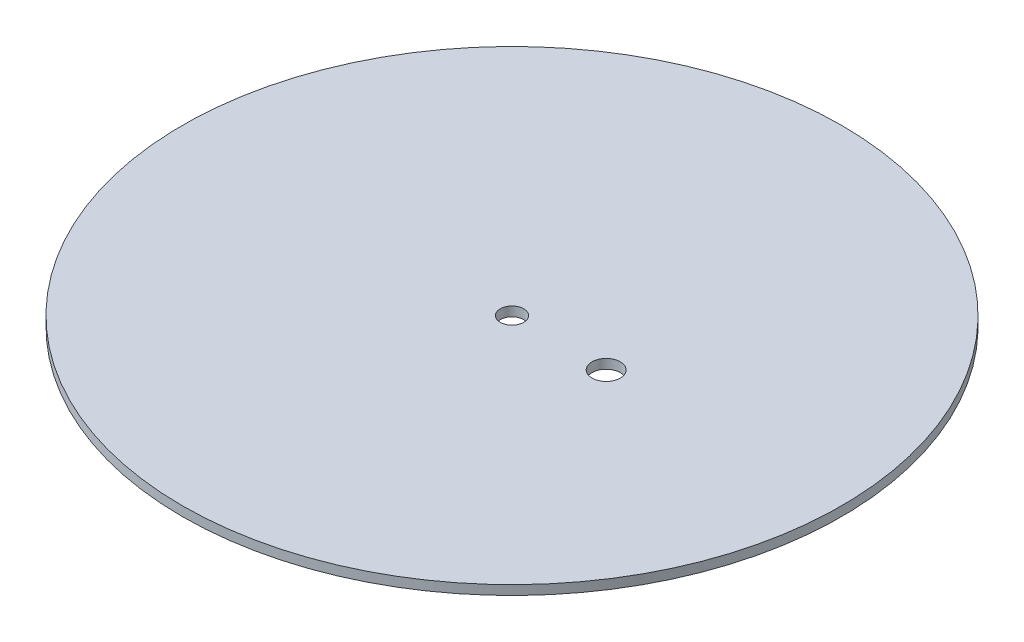
ISO-10303-21;
HEADER;
FILE_DESCRIPTION(('STEP AP214'),'2;1');
FILE_NAME('part.step','',(''),(''),'','','');
FILE_SCHEMA(('AUTOMOTIVE_DESIGN { 1 0 10303 214 1 1 1 1 }'));
ENDSEC;
DATA;
#1=APPLICATION_CONTEXT('core data for automotive mechanical design processes');
#2=APPLICATION_PROTOCOL_DEFINITION('international standard','automotive_design',2000,#1);
#3=PRODUCT_CONTEXT('',#1,'mechanical');
#4=PRODUCT('Part','Part','',(#3));
#5=PRODUCT_RELATED_PRODUCT_CATEGORY('part','',(#4));
#6=PRODUCT_DEFINITION_FORMATION('','',#4);
#7=PRODUCT_DEFINITION_CONTEXT('part definition',#1,'design');
#8=PRODUCT_DEFINITION('design','',#6,#7);
#9=PRODUCT_DEFINITION_SHAPE('','',#8);
#10=(LENGTH_UNIT() NAMED_UNIT(*) SI_UNIT(.MILLI.,.METRE.));
#11=(NAMED_UNIT(*) PLANE_ANGLE_UNIT() SI_UNIT($,.RADIAN.));
#12=(NAMED_UNIT(*) SI_UNIT($,.STERADIAN.) SOLID_ANGLE_UNIT());
#13=UNCERTAINTY_MEASURE_WITH_UNIT(LENGTH_MEASURE(1.E-05),#10,'distance_accuracy_value','');
#14=(GEOMETRIC_REPRESENTATION_CONTEXT(3) GLOBAL_UNCERTAINTY_ASSIGNED_CONTEXT((#13)) GLOBAL_UNIT_ASSIGNED_CONTEXT((#10,
#11,#12)) REPRESENTATION_CONTEXT('',''));
#15=CARTESIAN_POINT('',(0.,0.,0.));
#16=DIRECTION('',(0.,0.,1.));
#17=DIRECTION('',(1.,0.,0.));
#18=AXIS2_PLACEMENT_3D('',#15,#16,#17);
#19=CARTESIAN_POINT('',(0.,2.,0.));
#20=DIRECTION('',(0.,-1.,0.));
#21=DIRECTION('',(0.,0.,-1.));
#22=AXIS2_PLACEMENT_3D('',#19,#20,#21);
#23=CYLINDRICAL_SURFACE('',#22,70.);
#24=CARTESIAN_POINT('',(0.,2.,0.));
#25=DIRECTION('',(0.,1.,0.));
#26=DIRECTION('',(0.,0.,1.));
#27=AXIS2_PLACEMENT_3D('',#24,#25,#26);
#28=CIRCLE('',#27,70.);
#29=CARTESIAN_POINT('',(0.,2.,70.));
#30=VERTEX_POINT('',#29);
#31=EDGE_CURVE('E10',#30,#30,#28,.T.);
#32=ORIENTED_EDGE('',*,*,#31,.F.);
#33=EDGE_LOOP('',(#32));
#34=FACE_BOUND('',#33,.T.);
#35=CARTESIAN_POINT('',(0.,0.,0.));
#36=DIRECTION('',(0.,1.,0.));
#37=DIRECTION('',(0.,0.,1.));
#38=AXIS2_PLACEMENT_3D('',#35,#36,#37);
#39=CIRCLE('',#38,70.);
#40=CARTESIAN_POINT('',(0.,0.,70.));
#41=VERTEX_POINT('',#40);
#42=EDGE_CURVE('E42',#41,#41,#39,.T.);
#43=ORIENTED_EDGE('',*,*,#42,.T.);
#44=EDGE_LOOP('',(#43));
#45=FACE_BOUND('',#44,.T.);
#46=ADVANCED_FACE('F39',(#34,#45),#23,.T.);
#47=CARTESIAN_POINT('',(0.,2.,0.));
#48=DIRECTION('',(0.,1.,0.));
#49=DIRECTION('',(0.,0.,1.));
#50=AXIS2_PLACEMENT_3D('',#47,#48,#49);
#51=PLANE('',#50);
#52=CARTESIAN_POINT('',(0.,2.,0.));
#53=DIRECTION('',(0.,1.,0.));
#54=DIRECTION('',(0.,0.,1.));
#55=AXIS2_PLACEMENT_3D('',#52,#53,#54);
#56=CIRCLE('',#55,2.5);
#57=CARTESIAN_POINT('',(0.,2.,2.5));
#58=VERTEX_POINT('',#57);
#59=EDGE_CURVE('E57',#58,#58,#56,.T.);
#60=ORIENTED_EDGE('',*,*,#59,.F.);
#61=EDGE_LOOP('',(#60));
#62=FACE_BOUND('',#61,.T.);
#63=CARTESIAN_POINT('',(20.,2.,0.));
#64=DIRECTION('',(0.,1.,0.));
#65=DIRECTION('',(0.,0.,1.));
#66=AXIS2_PLACEMENT_3D('',#63,#64,#65);
#67=CIRCLE('',#66,3.);
#68=CARTESIAN_POINT('',(20.,2.,3.));
#69=VERTEX_POINT('',#68);
#70=EDGE_CURVE('E54',#69,#69,#67,.T.);
#71=ORIENTED_EDGE('',*,*,#70,.F.);
#72=EDGE_LOOP('',(#71));
#73=FACE_BOUND('',#72,.T.);
#74=ORIENTED_EDGE('',*,*,#31,.T.);
#75=EDGE_LOOP('',(#74));
#76=FACE_BOUND('',#75,.T.);
#77=ADVANCED_FACE('F73',(#62,#73,#76),#51,.T.);
#78=CARTESIAN_POINT('',(0.,0.,0.));
#79=DIRECTION('',(0.,1.,0.));
#80=DIRECTION('',(0.,0.,1.));
#81=AXIS2_PLACEMENT_3D('',#78,#79,#80);
#82=PLANE('',#81);
#83=CARTESIAN_POINT('',(0.,0.,0.));
#84=DIRECTION('',(0.,1.,0.));
#85=DIRECTION('',(0.,0.,1.));
#86=AXIS2_PLACEMENT_3D('',#83,#84,#85);
#87=CIRCLE('',#86,2.5);
#88=CARTESIAN_POINT('',(0.,0.,2.5));
#89=VERTEX_POINT('',#88);
#90=EDGE_CURVE('E49',#89,#89,#87,.T.);
#91=ORIENTED_EDGE('',*,*,#90,.T.);
#92=EDGE_LOOP('',(#91));
#93=FACE_BOUND('',#92,.T.);
#94=CARTESIAN_POINT('',(20.,0.,0.));
#95=DIRECTION('',(0.,1.,0.));
#96=DIRECTION('',(0.,0.,1.));
#97=AXIS2_PLACEMENT_3D('',#94,#95,#96);
#98=CIRCLE('',#97,3.);
#99=CARTESIAN_POINT('',(20.,0.,3.));
#100=VERTEX_POINT('',#99);
#101=EDGE_CURVE('E51',#100,#100,#98,.T.);
#102=ORIENTED_EDGE('',*,*,#101,.T.);
#103=EDGE_LOOP('',(#102));
#104=FACE_BOUND('',#103,.T.);
#105=ORIENTED_EDGE('',*,*,#42,.F.);
#106=EDGE_LOOP('',(#105));
#107=FACE_BOUND('',#106,.T.);
#108=ADVANCED_FACE('F63',(#93,#104,#107),#82,.F.);
#109=CARTESIAN_POINT('',(20.,0.,0.));
#110=DIRECTION('',(0.,1.,0.));
#111=DIRECTION('',(0.,0.,1.));
#112=AXIS2_PLACEMENT_3D('',#109,#110,#111);
#113=CYLINDRICAL_SURFACE('',#112,3.);
#114=ORIENTED_EDGE('',*,*,#101,.F.);
#115=EDGE_LOOP('',(#114));
#116=FACE_BOUND('',#115,.T.);
#117=ORIENTED_EDGE('',*,*,#70,.T.);
#118=EDGE_LOOP('',(#117));
#119=FACE_BOUND('',#118,.T.);
#120=ADVANCED_FACE('F69',(#116,#119),#113,.F.);
#121=CARTESIAN_POINT('',(0.,0.,0.));
#122=DIRECTION('',(0.,1.,0.));
#123=DIRECTION('',(0.,0.,1.));
#124=AXIS2_PLACEMENT_3D('',#121,#122,#123);
#125=CYLINDRICAL_SURFACE('',#124,2.5);
#126=ORIENTED_EDGE('',*,*,#90,.F.);
#127=EDGE_LOOP('',(#126));
#128=FACE_BOUND('',#127,.T.);
#129=ORIENTED_EDGE('',*,*,#59,.T.);
#130=EDGE_LOOP('',(#129));
#131=FACE_BOUND('',#130,.T.);
#132=ADVANCED_FACE('F66',(#128,#131),#125,.F.);
#133=CLOSED_SHELL('',(#46,#77,#108,#120,#132));
#134=MANIFOLD_SOLID_BREP('B2',#133);
#135=ADVANCED_BREP_SHAPE_REPRESENTATION('',(#18,#134),#14);
#136=SHAPE_DEFINITION_REPRESENTATION(#9,#135);
ENDSEC;
END-ISO-10303-21;
